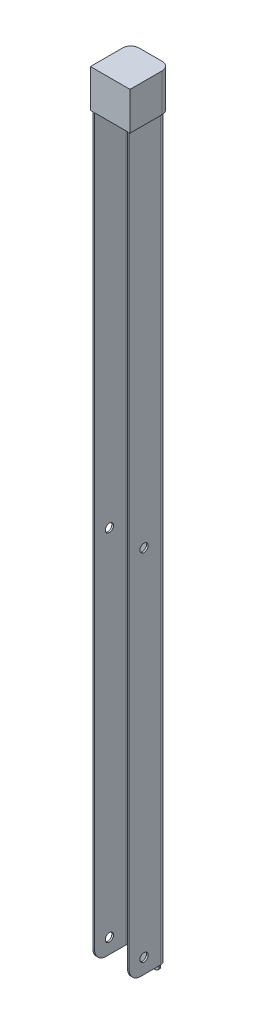
ISO-10303-21;
HEADER;
FILE_DESCRIPTION(('STEP AP214'),'2;1');
FILE_NAME('part.step','',(''),(''),'','','');
FILE_SCHEMA(('AUTOMOTIVE_DESIGN { 1 0 10303 214 1 1 1 1 }'));
ENDSEC;
DATA;
#1=APPLICATION_CONTEXT('core data for automotive mechanical design processes');
#2=APPLICATION_PROTOCOL_DEFINITION('international standard','automotive_design',2000,#1);
#3=PRODUCT_CONTEXT('',#1,'mechanical');
#4=PRODUCT('Part','Part','',(#3));
#5=PRODUCT_RELATED_PRODUCT_CATEGORY('part','',(#4));
#6=PRODUCT_DEFINITION_FORMATION('','',#4);
#7=PRODUCT_DEFINITION_CONTEXT('part definition',#1,'design');
#8=PRODUCT_DEFINITION('design','',#6,#7);
#9=PRODUCT_DEFINITION_SHAPE('','',#8);
#10=(LENGTH_UNIT() NAMED_UNIT(*) SI_UNIT(.MILLI.,.METRE.));
#11=(NAMED_UNIT(*) PLANE_ANGLE_UNIT() SI_UNIT($,.RADIAN.));
#12=(NAMED_UNIT(*) SI_UNIT($,.STERADIAN.) SOLID_ANGLE_UNIT());
#13=UNCERTAINTY_MEASURE_WITH_UNIT(LENGTH_MEASURE(1.E-05),#10,'distance_accuracy_value','');
#14=(GEOMETRIC_REPRESENTATION_CONTEXT(3) GLOBAL_UNCERTAINTY_ASSIGNED_CONTEXT((#13)) GLOBAL_UNIT_ASSIGNED_CONTEXT((#10,
#11,#12)) REPRESENTATION_CONTEXT('',''));
#15=CARTESIAN_POINT('',(0.,0.,0.));
#16=DIRECTION('',(0.,0.,1.));
#17=DIRECTION('',(1.,0.,0.));
#18=AXIS2_PLACEMENT_3D('',#15,#16,#17);
#19=CARTESIAN_POINT('',(7.,0.,-7.5));
#20=DIRECTION('',(0.,-1.,0.));
#21=DIRECTION('',(-1.,0.,0.));
#22=AXIS2_PLACEMENT_3D('',#19,#20,#21);
#23=PLANE('',#22);
#24=DIRECTION('',(0.,0.,-1.));
#25=VECTOR('',#24,1.);
#26=CARTESIAN_POINT('',(6.99999999999999,0.,-10.5));
#27=LINE('',#26,#25);
#28=CARTESIAN_POINT('',(6.99999999999999,0.,-10.5));
#29=VERTEX_POINT('',#28);
#30=CARTESIAN_POINT('',(6.99999999999999,0.,-11.5));
#31=VERTEX_POINT('',#30);
#32=EDGE_CURVE('E225',#29,#31,#27,.T.);
#33=ORIENTED_EDGE('',*,*,#32,.T.);
#34=CARTESIAN_POINT('',(7.,0.,-7.5));
#35=DIRECTION('',(0.,-1.,0.));
#36=DIRECTION('',(0.,0.,-1.));
#37=AXIS2_PLACEMENT_3D('',#34,#35,#36);
#38=CIRCLE('',#37,4.);
#39=CARTESIAN_POINT('',(11.,0.,-7.5));
#40=VERTEX_POINT('',#39);
#41=EDGE_CURVE('E199',#31,#40,#38,.T.);
#42=ORIENTED_EDGE('',*,*,#41,.T.);
#43=DIRECTION('',(0.,0.,1.));
#44=VECTOR('',#43,1.);
#45=CARTESIAN_POINT('',(11.,0.,-7.5));
#46=LINE('',#45,#44);
#47=CARTESIAN_POINT('',(11.,0.,4.5));
#48=VERTEX_POINT('',#47);
#49=EDGE_CURVE('E211',#40,#48,#46,.T.);
#50=ORIENTED_EDGE('',*,*,#49,.T.);
#51=DIRECTION('',(-1.,0.,0.));
#52=VECTOR('',#51,1.);
#53=CARTESIAN_POINT('',(7.,0.,4.5));
#54=LINE('',#53,#52);
#55=CARTESIAN_POINT('',(10.,0.,4.5));
#56=VERTEX_POINT('',#55);
#57=EDGE_CURVE('E369',#48,#56,#54,.T.);
#58=ORIENTED_EDGE('',*,*,#57,.T.);
#59=DIRECTION('',(0.,0.,1.));
#60=VECTOR('',#59,1.);
#61=CARTESIAN_POINT('',(9.99999999999999,0.,-7.5));
#62=LINE('',#61,#60);
#63=CARTESIAN_POINT('',(9.99999999999999,0.,-7.5));
#64=VERTEX_POINT('',#63);
#65=EDGE_CURVE('E328',#64,#56,#62,.T.);
#66=ORIENTED_EDGE('',*,*,#65,.F.);
#67=CARTESIAN_POINT('',(7.,0.,-7.5));
#68=DIRECTION('',(0.,1.,0.));
#69=DIRECTION('',(1.,0.,0.));
#70=AXIS2_PLACEMENT_3D('',#67,#68,#69);
#71=CIRCLE('',#70,3.);
#72=EDGE_CURVE('E228',#29,#64,#71,.F.);
#73=ORIENTED_EDGE('',*,*,#72,.F.);
#74=EDGE_LOOP('',(#33,#42,#50,#58,#66,#73));
#75=FACE_BOUND('',#74,.T.);
#76=ADVANCED_FACE('F36',(#75),#23,.T.);
#77=CARTESIAN_POINT('',(9.99999999999999,470.,-7.5));
#78=DIRECTION('',(1.,0.,0.));
#79=DIRECTION('',(0.,0.,-1.));
#80=AXIS2_PLACEMENT_3D('',#77,#78,#79);
#81=PLANE('',#80);
#82=CARTESIAN_POINT('',(10.,9.,2.5));
#83=DIRECTION('',(1.,0.,0.));
#84=DIRECTION('',(0.,0.,-1.));
#85=AXIS2_PLACEMENT_3D('',#82,#83,#84);
#86=CIRCLE('',#85,2.5);
#87=CARTESIAN_POINT('',(10.,9.,5.));
#88=VERTEX_POINT('',#87);
#89=EDGE_CURVE('E240',#88,#88,#86,.T.);
#90=ORIENTED_EDGE('',*,*,#89,.T.);
#91=EDGE_LOOP('',(#90));
#92=FACE_BOUND('',#91,.T.);
#93=CARTESIAN_POINT('',(10.,224.,2.5));
#94=DIRECTION('',(1.,0.,0.));
#95=DIRECTION('',(0.,0.,-1.));
#96=AXIS2_PLACEMENT_3D('',#93,#94,#95);
#97=CIRCLE('',#96,2.5);
#98=CARTESIAN_POINT('',(10.,224.,5.));
#99=VERTEX_POINT('',#98);
#100=EDGE_CURVE('E409',#99,#99,#97,.T.);
#101=ORIENTED_EDGE('',*,*,#100,.T.);
#102=EDGE_LOOP('',(#101));
#103=FACE_BOUND('',#102,.T.);
#104=DIRECTION('',(0.,0.,1.));
#105=VECTOR('',#104,1.);
#106=CARTESIAN_POINT('',(9.99999999999999,447.,-7.5));
#107=LINE('',#106,#105);
#108=CARTESIAN_POINT('',(9.99999999999999,447.,-7.5));
#109=VERTEX_POINT('',#108);
#110=CARTESIAN_POINT('',(10.,447.,11.5));
#111=VERTEX_POINT('',#110);
#112=EDGE_CURVE('E325',#109,#111,#107,.T.);
#113=ORIENTED_EDGE('',*,*,#112,.F.);
#114=DIRECTION('',(0.,-1.,0.));
#115=VECTOR('',#114,1.);
#116=CARTESIAN_POINT('',(9.99999999999999,470.,-7.5));
#117=LINE('',#116,#115);
#118=EDGE_CURVE('E344',#109,#64,#117,.T.);
#119=ORIENTED_EDGE('',*,*,#118,.T.);
#120=ORIENTED_EDGE('',*,*,#65,.T.);
#121=CARTESIAN_POINT('',(10.,7.,4.5));
#122=DIRECTION('',(1.,0.,0.));
#123=DIRECTION('',(0.,0.,-1.));
#124=AXIS2_PLACEMENT_3D('',#121,#122,#123);
#125=CIRCLE('',#124,7.);
#126=CARTESIAN_POINT('',(10.,7.00000000000012,11.5));
#127=VERTEX_POINT('',#126);
#128=EDGE_CURVE('E372',#56,#127,#125,.F.);
#129=ORIENTED_EDGE('',*,*,#128,.T.);
#130=DIRECTION('',(0.,-1.,0.));
#131=VECTOR('',#130,1.);
#132=CARTESIAN_POINT('',(10.,470.,11.5));
#133=LINE('',#132,#131);
#134=EDGE_CURVE('E364',#111,#127,#133,.T.);
#135=ORIENTED_EDGE('',*,*,#134,.F.);
#136=EDGE_LOOP('',(#113,#119,#120,#129,#135));
#137=FACE_BOUND('',#136,.T.);
#138=ADVANCED_FACE('F470',(#92,#103,#137),#81,.F.);
#139=CARTESIAN_POINT('',(11.,470.,11.5));
#140=DIRECTION('',(0.,0.,1.));
#141=DIRECTION('',(1.,0.,0.));
#142=AXIS2_PLACEMENT_3D('',#139,#140,#141);
#143=PLANE('',#142);
#144=DIRECTION('',(0.,-1.,0.));
#145=VECTOR('',#144,1.);
#146=CARTESIAN_POINT('',(11.,470.,11.5));
#147=LINE('',#146,#145);
#148=CARTESIAN_POINT('',(11.,447.,11.5));
#149=VERTEX_POINT('',#148);
#150=CARTESIAN_POINT('',(11.,7.00000000000012,11.5));
#151=VERTEX_POINT('',#150);
#152=EDGE_CURVE('E362',#149,#151,#147,.T.);
#153=ORIENTED_EDGE('',*,*,#152,.F.);
#154=DIRECTION('',(-1.,0.,0.));
#155=VECTOR('',#154,1.);
#156=CARTESIAN_POINT('',(11.,447.,11.5));
#157=LINE('',#156,#155);
#158=EDGE_CURVE('E323',#149,#111,#157,.T.);
#159=ORIENTED_EDGE('',*,*,#158,.T.);
#160=ORIENTED_EDGE('',*,*,#134,.T.);
#161=DIRECTION('',(-1.,0.,0.));
#162=VECTOR('',#161,1.);
#163=CARTESIAN_POINT('',(11.,7.00000000000001,11.5));
#164=LINE('',#163,#162);
#165=EDGE_CURVE('E375',#127,#151,#164,.F.);
#166=ORIENTED_EDGE('',*,*,#165,.T.);
#167=EDGE_LOOP('',(#153,#159,#160,#166));
#168=FACE_BOUND('',#167,.T.);
#169=ADVANCED_FACE('F492',(#168),#143,.T.);
#170=CARTESIAN_POINT('',(11.,470.,-7.5));
#171=DIRECTION('',(1.,0.,0.));
#172=DIRECTION('',(0.,0.,-1.));
#173=AXIS2_PLACEMENT_3D('',#170,#171,#172);
#174=PLANE('',#173);
#175=CARTESIAN_POINT('',(11.,9.,2.5));
#176=DIRECTION('',(1.,0.,0.));
#177=DIRECTION('',(0.,0.,-1.));
#178=AXIS2_PLACEMENT_3D('',#175,#176,#177);
#179=CIRCLE('',#178,2.5);
#180=CARTESIAN_POINT('',(11.,9.,5.));
#181=VERTEX_POINT('',#180);
#182=EDGE_CURVE('E246',#181,#181,#179,.T.);
#183=ORIENTED_EDGE('',*,*,#182,.F.);
#184=EDGE_LOOP('',(#183));
#185=FACE_BOUND('',#184,.T.);
#186=CARTESIAN_POINT('',(11.,224.,2.5));
#187=DIRECTION('',(1.,0.,0.));
#188=DIRECTION('',(0.,0.,-1.));
#189=AXIS2_PLACEMENT_3D('',#186,#187,#188);
#190=CIRCLE('',#189,2.5);
#191=CARTESIAN_POINT('',(11.,224.,5.));
#192=VERTEX_POINT('',#191);
#193=EDGE_CURVE('E404',#192,#192,#190,.T.);
#194=ORIENTED_EDGE('',*,*,#193,.F.);
#195=EDGE_LOOP('',(#194));
#196=FACE_BOUND('',#195,.T.);
#197=DIRECTION('',(0.,-1.,0.));
#198=VECTOR('',#197,1.);
#199=CARTESIAN_POINT('',(11.,470.,-7.5));
#200=LINE('',#199,#198);
#201=CARTESIAN_POINT('',(11.,447.,-7.5));
#202=VERTEX_POINT('',#201);
#203=EDGE_CURVE('E205',#202,#40,#200,.T.);
#204=ORIENTED_EDGE('',*,*,#203,.F.);
#205=DIRECTION('',(0.,0.,1.));
#206=VECTOR('',#205,1.);
#207=CARTESIAN_POINT('',(11.,447.,-7.5));
#208=LINE('',#207,#206);
#209=EDGE_CURVE('E321',#202,#149,#208,.T.);
#210=ORIENTED_EDGE('',*,*,#209,.T.);
#211=ORIENTED_EDGE('',*,*,#152,.T.);
#212=CARTESIAN_POINT('',(11.,7.,4.5));
#213=DIRECTION('',(1.,0.,0.));
#214=DIRECTION('',(0.,0.,-1.));
#215=AXIS2_PLACEMENT_3D('',#212,#213,#214);
#216=CIRCLE('',#215,7.);
#217=EDGE_CURVE('E378',#151,#48,#216,.T.);
#218=ORIENTED_EDGE('',*,*,#217,.T.);
#219=ORIENTED_EDGE('',*,*,#49,.F.);
#220=EDGE_LOOP('',(#204,#210,#211,#218,#219));
#221=FACE_BOUND('',#220,.T.);
#222=ADVANCED_FACE('F460',(#185,#196,#221),#174,.T.);
#223=CARTESIAN_POINT('',(7.,470.,-7.5));
#224=DIRECTION('',(0.,-1.,0.));
#225=DIRECTION('',(0.,0.,-1.));
#226=AXIS2_PLACEMENT_3D('',#223,#224,#225);
#227=CYLINDRICAL_SURFACE('',#226,4.);
#228=DIRECTION('',(0.,-1.,0.));
#229=VECTOR('',#228,1.);
#230=CARTESIAN_POINT('',(6.99999999999999,470.,-11.5));
#231=LINE('',#230,#229);
#232=CARTESIAN_POINT('',(6.99999999999999,447.,-11.5));
#233=VERTEX_POINT('',#232);
#234=EDGE_CURVE('E202',#233,#31,#231,.T.);
#235=ORIENTED_EDGE('',*,*,#234,.F.);
#236=CARTESIAN_POINT('',(7.,447.,-7.5));
#237=DIRECTION('',(0.,1.,0.));
#238=DIRECTION('',(0.,0.,1.));
#239=AXIS2_PLACEMENT_3D('',#236,#237,#238);
#240=CIRCLE('',#239,4.);
#241=EDGE_CURVE('E319',#233,#202,#240,.F.);
#242=ORIENTED_EDGE('',*,*,#241,.T.);
#243=ORIENTED_EDGE('',*,*,#203,.T.);
#244=ORIENTED_EDGE('',*,*,#41,.F.);
#245=EDGE_LOOP('',(#235,#242,#243,#244));
#246=FACE_BOUND('',#245,.T.);
#247=ADVANCED_FACE('F201',(#246),#227,.T.);
#248=CARTESIAN_POINT('',(6.99999999999999,470.,-11.5));
#249=DIRECTION('',(0.,0.,-1.));
#250=DIRECTION('',(-1.,0.,0.));
#251=AXIS2_PLACEMENT_3D('',#248,#249,#250);
#252=PLANE('',#251);
#253=DIRECTION('',(0.,-1.,0.));
#254=VECTOR('',#253,1.);
#255=CARTESIAN_POINT('',(6.99999999999999,0.,-11.5));
#256=LINE('',#255,#254);
#257=CARTESIAN_POINT('',(6.99999999999999,-5.,-11.5));
#258=VERTEX_POINT('',#257);
#259=EDGE_CURVE('E217',#31,#258,#256,.T.);
#260=ORIENTED_EDGE('',*,*,#259,.T.);
#261=CARTESIAN_POINT('',(4.99999999999999,-5.,-11.5));
#262=DIRECTION('',(0.,0.,-1.));
#263=DIRECTION('',(-1.,0.,0.));
#264=AXIS2_PLACEMENT_3D('',#261,#262,#263);
#265=CIRCLE('',#264,2.);
#266=CARTESIAN_POINT('',(4.99999999999999,-7.,-11.5));
#267=VERTEX_POINT('',#266);
#268=EDGE_CURVE('E394',#258,#267,#265,.T.);
#269=ORIENTED_EDGE('',*,*,#268,.T.);
#270=DIRECTION('',(-1.,0.,0.));
#271=VECTOR('',#270,1.);
#272=CARTESIAN_POINT('',(6.99999999999999,-7.,-11.5));
#273=LINE('',#272,#271);
#274=CARTESIAN_POINT('',(-5.,-7.,-11.5));
#275=VERTEX_POINT('',#274);
#276=EDGE_CURVE('E239',#267,#275,#273,.T.);
#277=ORIENTED_EDGE('',*,*,#276,.T.);
#278=CARTESIAN_POINT('',(-5.,-5.,-11.5));
#279=DIRECTION('',(0.,0.,-1.));
#280=DIRECTION('',(-1.,0.,0.));
#281=AXIS2_PLACEMENT_3D('',#278,#279,#280);
#282=CIRCLE('',#281,2.);
#283=CARTESIAN_POINT('',(-7.,-5.,-11.5));
#284=VERTEX_POINT('',#283);
#285=EDGE_CURVE('E392',#275,#284,#282,.T.);
#286=ORIENTED_EDGE('',*,*,#285,.T.);
#287=DIRECTION('',(0.,1.,0.));
#288=VECTOR('',#287,1.);
#289=CARTESIAN_POINT('',(-7.,0.,-11.5));
#290=LINE('',#289,#288);
#291=CARTESIAN_POINT('',(-7.,0.,-11.5));
#292=VERTEX_POINT('',#291);
#293=EDGE_CURVE('E243',#284,#292,#290,.T.);
#294=ORIENTED_EDGE('',*,*,#293,.T.);
#295=DIRECTION('',(0.,-1.,0.));
#296=VECTOR('',#295,1.);
#297=CARTESIAN_POINT('',(-7.,470.,-11.5));
#298=LINE('',#297,#296);
#299=CARTESIAN_POINT('',(-7.,447.,-11.5));
#300=VERTEX_POINT('',#299);
#301=EDGE_CURVE('E221',#300,#292,#298,.T.);
#302=ORIENTED_EDGE('',*,*,#301,.F.);
#303=DIRECTION('',(1.,0.,0.));
#304=VECTOR('',#303,1.);
#305=CARTESIAN_POINT('',(6.99999999999999,447.,-11.5));
#306=LINE('',#305,#304);
#307=EDGE_CURVE('E220',#300,#233,#306,.T.);
#308=ORIENTED_EDGE('',*,*,#307,.T.);
#309=ORIENTED_EDGE('',*,*,#234,.T.);
#310=EDGE_LOOP('',(#260,#269,#277,#286,#294,#302,#308,#309));
#311=FACE_BOUND('',#310,.T.);
#312=ADVANCED_FACE('F215',(#311),#252,.T.);
#313=CARTESIAN_POINT('',(-7.,470.,-7.5));
#314=DIRECTION('',(0.,-1.,0.));
#315=DIRECTION('',(0.,0.,-1.));
#316=AXIS2_PLACEMENT_3D('',#313,#314,#315);
#317=CYLINDRICAL_SURFACE('',#316,4.);
#318=DIRECTION('',(0.,-1.,0.));
#319=VECTOR('',#318,1.);
#320=CARTESIAN_POINT('',(-11.,470.,-7.5));
#321=LINE('',#320,#319);
#322=CARTESIAN_POINT('',(-11.,447.,-7.5));
#323=VERTEX_POINT('',#322);
#324=CARTESIAN_POINT('',(-11.,0.,-7.5));
#325=VERTEX_POINT('',#324);
#326=EDGE_CURVE('E357',#323,#325,#321,.T.);
#327=ORIENTED_EDGE('',*,*,#326,.F.);
#328=CARTESIAN_POINT('',(-7.,447.,-7.5));
#329=DIRECTION('',(0.,1.,0.));
#330=DIRECTION('',(0.,0.,1.));
#331=AXIS2_PLACEMENT_3D('',#328,#329,#330);
#332=CIRCLE('',#331,4.);
#333=EDGE_CURVE('E316',#323,#300,#332,.F.);
#334=ORIENTED_EDGE('',*,*,#333,.T.);
#335=ORIENTED_EDGE('',*,*,#301,.T.);
#336=CARTESIAN_POINT('',(-7.,0.,-7.5));
#337=DIRECTION('',(0.,-1.,0.));
#338=DIRECTION('',(0.,0.,1.));
#339=AXIS2_PLACEMENT_3D('',#336,#337,#338);
#340=CIRCLE('',#339,4.);
#341=EDGE_CURVE('E210',#325,#292,#340,.T.);
#342=ORIENTED_EDGE('',*,*,#341,.F.);
#343=EDGE_LOOP('',(#327,#334,#335,#342));
#344=FACE_BOUND('',#343,.T.);
#345=ADVANCED_FACE('F453',(#344),#317,.T.);
#346=CARTESIAN_POINT('',(-11.,470.,-7.5));
#347=DIRECTION('',(-1.,0.,0.));
#348=DIRECTION('',(0.,0.,1.));
#349=AXIS2_PLACEMENT_3D('',#346,#347,#348);
#350=PLANE('',#349);
#351=CARTESIAN_POINT('',(-11.,9.,2.5));
#352=DIRECTION('',(-1.,0.,0.));
#353=DIRECTION('',(0.,0.,1.));
#354=AXIS2_PLACEMENT_3D('',#351,#352,#353);
#355=CIRCLE('',#354,2.5);
#356=CARTESIAN_POINT('',(-11.,9.,5.));
#357=VERTEX_POINT('',#356);
#358=EDGE_CURVE('E405',#357,#357,#355,.T.);
#359=ORIENTED_EDGE('',*,*,#358,.F.);
#360=EDGE_LOOP('',(#359));
#361=FACE_BOUND('',#360,.T.);
#362=CARTESIAN_POINT('',(-11.,224.,2.5));
#363=DIRECTION('',(-1.,0.,0.));
#364=DIRECTION('',(0.,0.,1.));
#365=AXIS2_PLACEMENT_3D('',#362,#363,#364);
#366=CIRCLE('',#365,2.5);
#367=CARTESIAN_POINT('',(-11.,224.,5.));
#368=VERTEX_POINT('',#367);
#369=EDGE_CURVE('E412',#368,#368,#366,.T.);
#370=ORIENTED_EDGE('',*,*,#369,.F.);
#371=EDGE_LOOP('',(#370));
#372=FACE_BOUND('',#371,.T.);
#373=DIRECTION('',(0.,-1.,0.));
#374=VECTOR('',#373,1.);
#375=CARTESIAN_POINT('',(-11.,470.,11.5));
#376=LINE('',#375,#374);
#377=CARTESIAN_POINT('',(-11.,447.,11.5));
#378=VERTEX_POINT('',#377);
#379=CARTESIAN_POINT('',(-11.,7.00000000000012,11.5));
#380=VERTEX_POINT('',#379);
#381=EDGE_CURVE('E355',#378,#380,#376,.T.);
#382=ORIENTED_EDGE('',*,*,#381,.F.);
#383=DIRECTION('',(0.,0.,-1.));
#384=VECTOR('',#383,1.);
#385=CARTESIAN_POINT('',(-11.,447.,-7.5));
#386=LINE('',#385,#384);
#387=EDGE_CURVE('E314',#378,#323,#386,.T.);
#388=ORIENTED_EDGE('',*,*,#387,.T.);
#389=ORIENTED_EDGE('',*,*,#326,.T.);
#390=DIRECTION('',(0.,0.,-1.));
#391=VECTOR('',#390,1.);
#392=CARTESIAN_POINT('',(-11.,0.,-7.5));
#393=LINE('',#392,#391);
#394=CARTESIAN_POINT('',(-11.,0.,4.5));
#395=VERTEX_POINT('',#394);
#396=EDGE_CURVE('E334',#395,#325,#393,.T.);
#397=ORIENTED_EDGE('',*,*,#396,.F.);
#398=CARTESIAN_POINT('',(-11.,7.,4.5));
#399=DIRECTION('',(-1.,0.,0.));
#400=DIRECTION('',(0.,0.,1.));
#401=AXIS2_PLACEMENT_3D('',#398,#399,#400);
#402=CIRCLE('',#401,7.);
#403=EDGE_CURVE('E380',#395,#380,#402,.T.);
#404=ORIENTED_EDGE('',*,*,#403,.T.);
#405=EDGE_LOOP('',(#382,#388,#389,#397,#404));
#406=FACE_BOUND('',#405,.T.);
#407=ADVANCED_FACE('F449',(#361,#372,#406),#350,.T.);
#408=CARTESIAN_POINT('',(-10.,470.,11.5));
#409=DIRECTION('',(0.,0.,1.));
#410=DIRECTION('',(1.,0.,0.));
#411=AXIS2_PLACEMENT_3D('',#408,#409,#410);
#412=PLANE('',#411);
#413=DIRECTION('',(0.,-1.,0.));
#414=VECTOR('',#413,1.);
#415=CARTESIAN_POINT('',(-10.,470.,11.5));
#416=LINE('',#415,#414);
#417=CARTESIAN_POINT('',(-10.,447.,11.5));
#418=VERTEX_POINT('',#417);
#419=CARTESIAN_POINT('',(-10.,7.00000000000012,11.5));
#420=VERTEX_POINT('',#419);
#421=EDGE_CURVE('E353',#418,#420,#416,.T.);
#422=ORIENTED_EDGE('',*,*,#421,.F.);
#423=DIRECTION('',(-1.,0.,0.));
#424=VECTOR('',#423,1.);
#425=CARTESIAN_POINT('',(-10.,447.,11.5));
#426=LINE('',#425,#424);
#427=EDGE_CURVE('E312',#418,#378,#426,.T.);
#428=ORIENTED_EDGE('',*,*,#427,.T.);
#429=ORIENTED_EDGE('',*,*,#381,.T.);
#430=DIRECTION('',(-1.,0.,0.));
#431=VECTOR('',#430,1.);
#432=CARTESIAN_POINT('',(-10.,7.00000000000001,11.5));
#433=LINE('',#432,#431);
#434=EDGE_CURVE('E383',#380,#420,#433,.F.);
#435=ORIENTED_EDGE('',*,*,#434,.T.);
#436=EDGE_LOOP('',(#422,#428,#429,#435));
#437=FACE_BOUND('',#436,.T.);
#438=ADVANCED_FACE('F476',(#437),#412,.T.);
#439=CARTESIAN_POINT('',(-10.,470.,-7.5));
#440=DIRECTION('',(-1.,0.,0.));
#441=DIRECTION('',(0.,0.,1.));
#442=AXIS2_PLACEMENT_3D('',#439,#440,#441);
#443=PLANE('',#442);
#444=CARTESIAN_POINT('',(-10.,9.,2.5));
#445=DIRECTION('',(-1.,0.,0.));
#446=DIRECTION('',(0.,0.,1.));
#447=AXIS2_PLACEMENT_3D('',#444,#445,#446);
#448=CIRCLE('',#447,2.5);
#449=CARTESIAN_POINT('',(-10.,9.,5.));
#450=VERTEX_POINT('',#449);
#451=EDGE_CURVE('E40',#450,#450,#448,.T.);
#452=ORIENTED_EDGE('',*,*,#451,.T.);
#453=EDGE_LOOP('',(#452));
#454=FACE_BOUND('',#453,.T.);
#455=CARTESIAN_POINT('',(-10.,224.,2.5));
#456=DIRECTION('',(-1.,0.,0.));
#457=DIRECTION('',(0.,0.,1.));
#458=AXIS2_PLACEMENT_3D('',#455,#456,#457);
#459=CIRCLE('',#458,2.5);
#460=CARTESIAN_POINT('',(-10.,224.,5.));
#461=VERTEX_POINT('',#460);
#462=EDGE_CURVE('E402',#461,#461,#459,.T.);
#463=ORIENTED_EDGE('',*,*,#462,.T.);
#464=EDGE_LOOP('',(#463));
#465=FACE_BOUND('',#464,.T.);
#466=DIRECTION('',(0.,0.,-1.));
#467=VECTOR('',#466,1.);
#468=CARTESIAN_POINT('',(-10.,447.,-7.5));
#469=LINE('',#468,#467);
#470=CARTESIAN_POINT('',(-10.,447.,-7.5));
#471=VERTEX_POINT('',#470);
#472=EDGE_CURVE('E309',#418,#471,#469,.T.);
#473=ORIENTED_EDGE('',*,*,#472,.F.);
#474=ORIENTED_EDGE('',*,*,#421,.T.);
#475=CARTESIAN_POINT('',(-10.,7.,4.5));
#476=DIRECTION('',(-1.,0.,0.));
#477=DIRECTION('',(0.,0.,1.));
#478=AXIS2_PLACEMENT_3D('',#475,#476,#477);
#479=CIRCLE('',#478,7.);
#480=CARTESIAN_POINT('',(-10.,0.,4.5));
#481=VERTEX_POINT('',#480);
#482=EDGE_CURVE('E386',#420,#481,#479,.F.);
#483=ORIENTED_EDGE('',*,*,#482,.T.);
#484=DIRECTION('',(0.,0.,-1.));
#485=VECTOR('',#484,1.);
#486=CARTESIAN_POINT('',(-10.,0.,-7.5));
#487=LINE('',#486,#485);
#488=CARTESIAN_POINT('',(-10.,0.,-7.5));
#489=VERTEX_POINT('',#488);
#490=EDGE_CURVE('E337',#481,#489,#487,.T.);
#491=ORIENTED_EDGE('',*,*,#490,.T.);
#492=DIRECTION('',(0.,-1.,0.));
#493=VECTOR('',#492,1.);
#494=CARTESIAN_POINT('',(-10.,470.,-7.5));
#495=LINE('',#494,#493);
#496=EDGE_CURVE('E351',#471,#489,#495,.T.);
#497=ORIENTED_EDGE('',*,*,#496,.F.);
#498=EDGE_LOOP('',(#473,#474,#483,#491,#497));
#499=FACE_BOUND('',#498,.T.);
#500=ADVANCED_FACE('F440',(#454,#465,#499),#443,.F.);
#501=CARTESIAN_POINT('',(-7.,470.,-7.5));
#502=DIRECTION('',(0.,-1.,0.));
#503=DIRECTION('',(0.,0.,-1.));
#504=AXIS2_PLACEMENT_3D('',#501,#502,#503);
#505=CYLINDRICAL_SURFACE('',#504,3.);
#506=CARTESIAN_POINT('',(-7.,447.,-7.5));
#507=DIRECTION('',(0.,1.,0.));
#508=DIRECTION('',(0.,0.,1.));
#509=AXIS2_PLACEMENT_3D('',#506,#507,#508);
#510=CIRCLE('',#509,3.);
#511=CARTESIAN_POINT('',(-7.,447.,-10.5));
#512=VERTEX_POINT('',#511);
#513=EDGE_CURVE('E306',#471,#512,#510,.F.);
#514=ORIENTED_EDGE('',*,*,#513,.F.);
#515=ORIENTED_EDGE('',*,*,#496,.T.);
#516=CARTESIAN_POINT('',(-7.,0.,-7.5));
#517=DIRECTION('',(0.,1.,0.));
#518=DIRECTION('',(1.,0.,0.));
#519=AXIS2_PLACEMENT_3D('',#516,#517,#518);
#520=CIRCLE('',#519,3.);
#521=CARTESIAN_POINT('',(-7.,0.,-10.5));
#522=VERTEX_POINT('',#521);
#523=EDGE_CURVE('E340',#489,#522,#520,.F.);
#524=ORIENTED_EDGE('',*,*,#523,.T.);
#525=DIRECTION('',(0.,-1.,0.));
#526=VECTOR('',#525,1.);
#527=CARTESIAN_POINT('',(-7.,470.,-10.5));
#528=LINE('',#527,#526);
#529=EDGE_CURVE('E348',#512,#522,#528,.T.);
#530=ORIENTED_EDGE('',*,*,#529,.F.);
#531=EDGE_LOOP('',(#514,#515,#524,#530));
#532=FACE_BOUND('',#531,.T.);
#533=ADVANCED_FACE('F437',(#532),#505,.F.);
#534=CARTESIAN_POINT('',(6.99999999999999,470.,-10.5));
#535=DIRECTION('',(0.,0.,-1.));
#536=DIRECTION('',(-1.,0.,0.));
#537=AXIS2_PLACEMENT_3D('',#534,#535,#536);
#538=PLANE('',#537);
#539=DIRECTION('',(-1.,0.,0.));
#540=VECTOR('',#539,1.);
#541=CARTESIAN_POINT('',(6.99999999999999,-7.,-10.5));
#542=LINE('',#541,#540);
#543=CARTESIAN_POINT('',(4.99999999999999,-7.,-10.5));
#544=VERTEX_POINT('',#543);
#545=CARTESIAN_POINT('',(-5.,-7.,-10.5));
#546=VERTEX_POINT('',#545);
#547=EDGE_CURVE('E423',#544,#546,#542,.T.);
#548=ORIENTED_EDGE('',*,*,#547,.F.);
#549=CARTESIAN_POINT('',(4.99999999999999,-5.,-10.5));
#550=DIRECTION('',(0.,0.,-1.));
#551=DIRECTION('',(-1.,0.,0.));
#552=AXIS2_PLACEMENT_3D('',#549,#550,#551);
#553=CIRCLE('',#552,2.);
#554=CARTESIAN_POINT('',(6.99999999999999,-5.,-10.5));
#555=VERTEX_POINT('',#554);
#556=EDGE_CURVE('E45',#544,#555,#553,.F.);
#557=ORIENTED_EDGE('',*,*,#556,.T.);
#558=DIRECTION('',(0.,-1.,0.));
#559=VECTOR('',#558,1.);
#560=CARTESIAN_POINT('',(6.99999999999999,0.,-10.5));
#561=LINE('',#560,#559);
#562=EDGE_CURVE('E252',#29,#555,#561,.T.);
#563=ORIENTED_EDGE('',*,*,#562,.F.);
#564=DIRECTION('',(0.,-1.,0.));
#565=VECTOR('',#564,1.);
#566=CARTESIAN_POINT('',(6.99999999999999,470.,-10.5));
#567=LINE('',#566,#565);
#568=CARTESIAN_POINT('',(6.99999999999999,447.,-10.5));
#569=VERTEX_POINT('',#568);
#570=EDGE_CURVE('E346',#569,#29,#567,.T.);
#571=ORIENTED_EDGE('',*,*,#570,.F.);
#572=DIRECTION('',(1.,0.,0.));
#573=VECTOR('',#572,1.);
#574=CARTESIAN_POINT('',(6.99999999999999,447.,-10.5));
#575=LINE('',#574,#573);
#576=EDGE_CURVE('E292',#512,#569,#575,.T.);
#577=ORIENTED_EDGE('',*,*,#576,.F.);
#578=ORIENTED_EDGE('',*,*,#529,.T.);
#579=DIRECTION('',(0.,1.,0.));
#580=VECTOR('',#579,1.);
#581=CARTESIAN_POINT('',(-7.,0.,-10.5));
#582=LINE('',#581,#580);
#583=CARTESIAN_POINT('',(-7.,-5.,-10.5));
#584=VERTEX_POINT('',#583);
#585=EDGE_CURVE('E249',#584,#522,#582,.T.);
#586=ORIENTED_EDGE('',*,*,#585,.F.);
#587=CARTESIAN_POINT('',(-5.,-5.,-10.5));
#588=DIRECTION('',(0.,0.,-1.));
#589=DIRECTION('',(-1.,0.,0.));
#590=AXIS2_PLACEMENT_3D('',#587,#588,#589);
#591=CIRCLE('',#590,2.);
#592=EDGE_CURVE('E58',#584,#546,#591,.F.);
#593=ORIENTED_EDGE('',*,*,#592,.T.);
#594=EDGE_LOOP('',(#548,#557,#563,#571,#577,#578,#586,#593));
#595=FACE_BOUND('',#594,.T.);
#596=ADVANCED_FACE('F434',(#595),#538,.F.);
#597=CARTESIAN_POINT('',(7.,470.,-7.5));
#598=DIRECTION('',(0.,-1.,0.));
#599=DIRECTION('',(0.,0.,-1.));
#600=AXIS2_PLACEMENT_3D('',#597,#598,#599);
#601=CYLINDRICAL_SURFACE('',#600,3.);
#602=CARTESIAN_POINT('',(7.,447.,-7.5));
#603=DIRECTION('',(0.,1.,0.));
#604=DIRECTION('',(0.,0.,1.));
#605=AXIS2_PLACEMENT_3D('',#602,#603,#604);
#606=CIRCLE('',#605,3.);
#607=EDGE_CURVE('E388',#569,#109,#606,.F.);
#608=ORIENTED_EDGE('',*,*,#607,.F.);
#609=ORIENTED_EDGE('',*,*,#570,.T.);
#610=ORIENTED_EDGE('',*,*,#72,.T.);
#611=ORIENTED_EDGE('',*,*,#118,.F.);
#612=EDGE_LOOP('',(#608,#609,#610,#611));
#613=FACE_BOUND('',#612,.T.);
#614=ADVANCED_FACE('F472',(#613),#601,.F.);
#615=DIRECTION('',(0.,0.,-1.));
#616=VECTOR('',#615,1.);
#617=CARTESIAN_POINT('',(-7.,0.,-10.5));
#618=LINE('',#617,#616);
#619=EDGE_CURVE('E233',#522,#292,#618,.T.);
#620=ORIENTED_EDGE('',*,*,#619,.F.);
#621=ORIENTED_EDGE('',*,*,#523,.F.);
#622=ORIENTED_EDGE('',*,*,#490,.F.);
#623=DIRECTION('',(-1.,0.,0.));
#624=VECTOR('',#623,1.);
#625=CARTESIAN_POINT('',(7.,0.,4.5));
#626=LINE('',#625,#624);
#627=EDGE_CURVE('E366',#481,#395,#626,.T.);
#628=ORIENTED_EDGE('',*,*,#627,.T.);
#629=ORIENTED_EDGE('',*,*,#396,.T.);
#630=ORIENTED_EDGE('',*,*,#341,.T.);
#631=EDGE_LOOP('',(#620,#621,#622,#628,#629,#630));
#632=FACE_BOUND('',#631,.T.);
#633=ADVANCED_FACE('F430',(#632),#23,.T.);
#634=CARTESIAN_POINT('',(7.,7.,4.5));
#635=DIRECTION('',(-1.,0.,0.));
#636=DIRECTION('',(0.,0.,1.));
#637=AXIS2_PLACEMENT_3D('',#634,#635,#636);
#638=CYLINDRICAL_SURFACE('',#637,7.);
#639=ORIENTED_EDGE('',*,*,#217,.F.);
#640=ORIENTED_EDGE('',*,*,#165,.F.);
#641=ORIENTED_EDGE('',*,*,#128,.F.);
#642=ORIENTED_EDGE('',*,*,#57,.F.);
#643=EDGE_LOOP('',(#639,#640,#641,#642));
#644=FACE_BOUND('',#643,.T.);
#645=ADVANCED_FACE('F465',(#644),#638,.T.);
#646=CARTESIAN_POINT('',(7.,7.,4.5));
#647=DIRECTION('',(-1.,0.,0.));
#648=DIRECTION('',(0.,0.,1.));
#649=AXIS2_PLACEMENT_3D('',#646,#647,#648);
#650=CYLINDRICAL_SURFACE('',#649,7.);
#651=ORIENTED_EDGE('',*,*,#482,.F.);
#652=ORIENTED_EDGE('',*,*,#434,.F.);
#653=ORIENTED_EDGE('',*,*,#403,.F.);
#654=ORIENTED_EDGE('',*,*,#627,.F.);
#655=EDGE_LOOP('',(#651,#652,#653,#654));
#656=FACE_BOUND('',#655,.T.);
#657=ADVANCED_FACE('F445',(#656),#650,.T.);
#658=CARTESIAN_POINT('',(7.,447.,-7.5));
#659=DIRECTION('',(0.,1.,0.));
#660=DIRECTION('',(0.,0.,1.));
#661=AXIS2_PLACEMENT_3D('',#658,#659,#660);
#662=PLANE('',#661);
#663=DIRECTION('',(0.,0.,1.));
#664=VECTOR('',#663,1.);
#665=CARTESIAN_POINT('',(-12.,447.,11.5));
#666=LINE('',#665,#664);
#667=CARTESIAN_POINT('',(-12.,447.,-7.5));
#668=VERTEX_POINT('',#667);
#669=CARTESIAN_POINT('',(-12.,447.,12.));
#670=VERTEX_POINT('',#669);
#671=EDGE_CURVE('E256',#668,#670,#666,.T.);
#672=ORIENTED_EDGE('',*,*,#671,.F.);
#673=CARTESIAN_POINT('',(-7.,447.,-7.5));
#674=DIRECTION('',(0.,1.,0.));
#675=DIRECTION('',(0.,0.,1.));
#676=AXIS2_PLACEMENT_3D('',#673,#674,#675);
#677=CIRCLE('',#676,5.);
#678=CARTESIAN_POINT('',(-7.,447.,-12.5));
#679=VERTEX_POINT('',#678);
#680=EDGE_CURVE('E271',#679,#668,#677,.T.);
#681=ORIENTED_EDGE('',*,*,#680,.F.);
#682=DIRECTION('',(-1.,0.,0.));
#683=VECTOR('',#682,1.);
#684=CARTESIAN_POINT('',(-7.,447.,-12.5));
#685=LINE('',#684,#683);
#686=CARTESIAN_POINT('',(6.99999999999999,447.,-12.5));
#687=VERTEX_POINT('',#686);
#688=EDGE_CURVE('E268',#687,#679,#685,.T.);
#689=ORIENTED_EDGE('',*,*,#688,.F.);
#690=CARTESIAN_POINT('',(7.,447.,-7.5));
#691=DIRECTION('',(0.,1.,0.));
#692=DIRECTION('',(0.,0.,1.));
#693=AXIS2_PLACEMENT_3D('',#690,#691,#692);
#694=CIRCLE('',#693,5.);
#695=CARTESIAN_POINT('',(12.,447.,-7.5));
#696=VERTEX_POINT('',#695);
#697=EDGE_CURVE('E265',#696,#687,#694,.T.);
#698=ORIENTED_EDGE('',*,*,#697,.F.);
#699=DIRECTION('',(0.,0.,-1.));
#700=VECTOR('',#699,1.);
#701=CARTESIAN_POINT('',(12.,447.,12.));
#702=LINE('',#701,#700);
#703=CARTESIAN_POINT('',(12.,447.,12.));
#704=VERTEX_POINT('',#703);
#705=EDGE_CURVE('E263',#704,#696,#702,.T.);
#706=ORIENTED_EDGE('',*,*,#705,.F.);
#707=DIRECTION('',(1.,0.,0.));
#708=VECTOR('',#707,1.);
#709=CARTESIAN_POINT('',(-12.,447.,12.));
#710=LINE('',#709,#708);
#711=EDGE_CURVE('E259',#670,#704,#710,.T.);
#712=ORIENTED_EDGE('',*,*,#711,.F.);
#713=EDGE_LOOP('',(#672,#681,#689,#698,#706,#712));
#714=FACE_BOUND('',#713,.T.);
#715=ORIENTED_EDGE('',*,*,#607,.T.);
#716=ORIENTED_EDGE('',*,*,#112,.T.);
#717=ORIENTED_EDGE('',*,*,#158,.F.);
#718=ORIENTED_EDGE('',*,*,#209,.F.);
#719=ORIENTED_EDGE('',*,*,#241,.F.);
#720=ORIENTED_EDGE('',*,*,#307,.F.);
#721=ORIENTED_EDGE('',*,*,#333,.F.);
#722=ORIENTED_EDGE('',*,*,#387,.F.);
#723=ORIENTED_EDGE('',*,*,#427,.F.);
#724=ORIENTED_EDGE('',*,*,#472,.T.);
#725=ORIENTED_EDGE('',*,*,#513,.T.);
#726=ORIENTED_EDGE('',*,*,#576,.T.);
#727=EDGE_LOOP('',(#715,#716,#717,#718,#719,#720,#721,#722,#723,#724,#725,#726));
#728=FACE_BOUND('',#727,.T.);
#729=ADVANCED_FACE('F456',(#714,#728),#662,.F.);
#730=CARTESIAN_POINT('',(-12.,447.,11.5));
#731=DIRECTION('',(-1.,0.,0.));
#732=DIRECTION('',(0.,0.,1.));
#733=AXIS2_PLACEMENT_3D('',#730,#731,#732);
#734=PLANE('',#733);
#735=DIRECTION('',(0.,0.,1.));
#736=VECTOR('',#735,1.);
#737=CARTESIAN_POINT('',(-12.,470.,11.5));
#738=LINE('',#737,#736);
#739=CARTESIAN_POINT('',(-12.,470.,-7.5));
#740=VERTEX_POINT('',#739);
#741=CARTESIAN_POINT('',(-12.,470.,12.));
#742=VERTEX_POINT('',#741);
#743=EDGE_CURVE('E260',#740,#742,#738,.T.);
#744=ORIENTED_EDGE('',*,*,#743,.F.);
#745=DIRECTION('',(0.,1.,0.));
#746=VECTOR('',#745,1.);
#747=CARTESIAN_POINT('',(-12.,447.,-7.5));
#748=LINE('',#747,#746);
#749=EDGE_CURVE('E290',#668,#740,#748,.T.);
#750=ORIENTED_EDGE('',*,*,#749,.F.);
#751=ORIENTED_EDGE('',*,*,#671,.T.);
#752=DIRECTION('',(0.,1.,0.));
#753=VECTOR('',#752,1.);
#754=CARTESIAN_POINT('',(-12.,447.,12.));
#755=LINE('',#754,#753);
#756=EDGE_CURVE('E274',#670,#742,#755,.T.);
#757=ORIENTED_EDGE('',*,*,#756,.T.);
#758=EDGE_LOOP('',(#744,#750,#751,#757));
#759=FACE_BOUND('',#758,.T.);
#760=ADVANCED_FACE('F645',(#759),#734,.T.);
#761=CARTESIAN_POINT('',(-7.,447.,-7.5));
#762=DIRECTION('',(0.,1.,0.));
#763=DIRECTION('',(0.,0.,1.));
#764=AXIS2_PLACEMENT_3D('',#761,#762,#763);
#765=CYLINDRICAL_SURFACE('',#764,5.);
#766=CARTESIAN_POINT('',(-7.,470.,-7.5));
#767=DIRECTION('',(0.,1.,0.));
#768=DIRECTION('',(0.,0.,1.));
#769=AXIS2_PLACEMENT_3D('',#766,#767,#768);
#770=CIRCLE('',#769,5.);
#771=CARTESIAN_POINT('',(-7.,470.,-12.5));
#772=VERTEX_POINT('',#771);
#773=EDGE_CURVE('E286',#772,#740,#770,.T.);
#774=ORIENTED_EDGE('',*,*,#773,.F.);
#775=DIRECTION('',(0.,1.,0.));
#776=VECTOR('',#775,1.);
#777=CARTESIAN_POINT('',(-7.,447.,-12.5));
#778=LINE('',#777,#776);
#779=EDGE_CURVE('E293',#679,#772,#778,.T.);
#780=ORIENTED_EDGE('',*,*,#779,.F.);
#781=ORIENTED_EDGE('',*,*,#680,.T.);
#782=ORIENTED_EDGE('',*,*,#749,.T.);
#783=EDGE_LOOP('',(#774,#780,#781,#782));
#784=FACE_BOUND('',#783,.T.);
#785=ADVANCED_FACE('F649',(#784),#765,.T.);
#786=CARTESIAN_POINT('',(-7.,447.,-12.5));
#787=DIRECTION('',(0.,0.,-1.));
#788=DIRECTION('',(-1.,0.,0.));
#789=AXIS2_PLACEMENT_3D('',#786,#787,#788);
#790=PLANE('',#789);
#791=DIRECTION('',(-1.,0.,0.));
#792=VECTOR('',#791,1.);
#793=CARTESIAN_POINT('',(-7.,470.,-12.5));
#794=LINE('',#793,#792);
#795=CARTESIAN_POINT('',(6.99999999999999,470.,-12.5));
#796=VERTEX_POINT('',#795);
#797=EDGE_CURVE('E283',#796,#772,#794,.T.);
#798=ORIENTED_EDGE('',*,*,#797,.F.);
#799=DIRECTION('',(0.,1.,0.));
#800=VECTOR('',#799,1.);
#801=CARTESIAN_POINT('',(6.99999999999999,447.,-12.5));
#802=LINE('',#801,#800);
#803=EDGE_CURVE('E295',#687,#796,#802,.T.);
#804=ORIENTED_EDGE('',*,*,#803,.F.);
#805=ORIENTED_EDGE('',*,*,#688,.T.);
#806=ORIENTED_EDGE('',*,*,#779,.T.);
#807=EDGE_LOOP('',(#798,#804,#805,#806));
#808=FACE_BOUND('',#807,.T.);
#809=ADVANCED_FACE('F653',(#808),#790,.T.);
#810=CARTESIAN_POINT('',(7.,447.,-7.5));
#811=DIRECTION('',(0.,1.,0.));
#812=DIRECTION('',(0.,0.,1.));
#813=AXIS2_PLACEMENT_3D('',#810,#811,#812);
#814=CYLINDRICAL_SURFACE('',#813,5.);
#815=CARTESIAN_POINT('',(7.,470.,-7.5));
#816=DIRECTION('',(0.,1.,0.));
#817=DIRECTION('',(0.,0.,1.));
#818=AXIS2_PLACEMENT_3D('',#815,#816,#817);
#819=CIRCLE('',#818,5.);
#820=CARTESIAN_POINT('',(12.,470.,-7.5));
#821=VERTEX_POINT('',#820);
#822=EDGE_CURVE('E280',#821,#796,#819,.T.);
#823=ORIENTED_EDGE('',*,*,#822,.F.);
#824=DIRECTION('',(0.,1.,0.));
#825=VECTOR('',#824,1.);
#826=CARTESIAN_POINT('',(12.,447.,-7.5));
#827=LINE('',#826,#825);
#828=EDGE_CURVE('E297',#696,#821,#827,.T.);
#829=ORIENTED_EDGE('',*,*,#828,.F.);
#830=ORIENTED_EDGE('',*,*,#697,.T.);
#831=ORIENTED_EDGE('',*,*,#803,.T.);
#832=EDGE_LOOP('',(#823,#829,#830,#831));
#833=FACE_BOUND('',#832,.T.);
#834=ADVANCED_FACE('F657',(#833),#814,.T.);
#835=CARTESIAN_POINT('',(12.,447.,-7.5));
#836=DIRECTION('',(1.,0.,0.));
#837=DIRECTION('',(0.,0.,-1.));
#838=AXIS2_PLACEMENT_3D('',#835,#836,#837);
#839=PLANE('',#838);
#840=DIRECTION('',(0.,0.,-1.));
#841=VECTOR('',#840,1.);
#842=CARTESIAN_POINT('',(12.,470.,-7.5));
#843=LINE('',#842,#841);
#844=CARTESIAN_POINT('',(12.,470.,12.));
#845=VERTEX_POINT('',#844);
#846=EDGE_CURVE('E277',#845,#821,#843,.T.);
#847=ORIENTED_EDGE('',*,*,#846,.F.);
#848=DIRECTION('',(0.,1.,0.));
#849=VECTOR('',#848,1.);
#850=CARTESIAN_POINT('',(12.,447.,12.));
#851=LINE('',#850,#849);
#852=EDGE_CURVE('E299',#704,#845,#851,.T.);
#853=ORIENTED_EDGE('',*,*,#852,.F.);
#854=ORIENTED_EDGE('',*,*,#705,.T.);
#855=ORIENTED_EDGE('',*,*,#828,.T.);
#856=EDGE_LOOP('',(#847,#853,#854,#855));
#857=FACE_BOUND('',#856,.T.);
#858=ADVANCED_FACE('F661',(#857),#839,.T.);
#859=CARTESIAN_POINT('',(-12.,447.,12.));
#860=DIRECTION('',(0.,0.,1.));
#861=DIRECTION('',(1.,0.,0.));
#862=AXIS2_PLACEMENT_3D('',#859,#860,#861);
#863=PLANE('',#862);
#864=DIRECTION('',(1.,0.,0.));
#865=VECTOR('',#864,1.);
#866=CARTESIAN_POINT('',(-12.,470.,12.));
#867=LINE('',#866,#865);
#868=EDGE_CURVE('E232',#742,#845,#867,.T.);
#869=ORIENTED_EDGE('',*,*,#868,.F.);
#870=ORIENTED_EDGE('',*,*,#756,.F.);
#871=ORIENTED_EDGE('',*,*,#711,.T.);
#872=ORIENTED_EDGE('',*,*,#852,.T.);
#873=EDGE_LOOP('',(#869,#870,#871,#872));
#874=FACE_BOUND('',#873,.T.);
#875=ADVANCED_FACE('F665',(#874),#863,.T.);
#876=CARTESIAN_POINT('',(7.,470.,-7.5));
#877=DIRECTION('',(0.,-1.,0.));
#878=DIRECTION('',(-1.,0.,0.));
#879=AXIS2_PLACEMENT_3D('',#876,#877,#878);
#880=PLANE('',#879);
#881=ORIENTED_EDGE('',*,*,#743,.T.);
#882=ORIENTED_EDGE('',*,*,#868,.T.);
#883=ORIENTED_EDGE('',*,*,#846,.T.);
#884=ORIENTED_EDGE('',*,*,#822,.T.);
#885=ORIENTED_EDGE('',*,*,#797,.T.);
#886=ORIENTED_EDGE('',*,*,#773,.T.);
#887=EDGE_LOOP('',(#881,#882,#883,#884,#885,#886));
#888=FACE_BOUND('',#887,.T.);
#889=ADVANCED_FACE('F532',(#888),#880,.F.);
#890=CARTESIAN_POINT('',(6.99999999999999,0.,-10.5));
#891=DIRECTION('',(1.,0.,0.));
#892=DIRECTION('',(0.,0.,-1.));
#893=AXIS2_PLACEMENT_3D('',#890,#891,#892);
#894=PLANE('',#893);
#895=ORIENTED_EDGE('',*,*,#562,.T.);
#896=DIRECTION('',(0.,0.,-1.));
#897=VECTOR('',#896,1.);
#898=CARTESIAN_POINT('',(6.99999999999999,-5.,-10.5));
#899=LINE('',#898,#897);
#900=EDGE_CURVE('E238',#555,#258,#899,.T.);
#901=ORIENTED_EDGE('',*,*,#900,.T.);
#902=ORIENTED_EDGE('',*,*,#259,.F.);
#903=ORIENTED_EDGE('',*,*,#32,.F.);
#904=EDGE_LOOP('',(#895,#901,#902,#903));
#905=FACE_BOUND('',#904,.T.);
#906=ADVANCED_FACE('F236',(#905),#894,.T.);
#907=CARTESIAN_POINT('',(-7.,0.,-10.5));
#908=DIRECTION('',(-1.,0.,0.));
#909=DIRECTION('',(0.,0.,1.));
#910=AXIS2_PLACEMENT_3D('',#907,#908,#909);
#911=PLANE('',#910);
#912=ORIENTED_EDGE('',*,*,#293,.F.);
#913=DIRECTION('',(0.,0.,-1.));
#914=VECTOR('',#913,1.);
#915=CARTESIAN_POINT('',(-7.,-5.,-10.5));
#916=LINE('',#915,#914);
#917=EDGE_CURVE('E11',#284,#584,#916,.F.);
#918=ORIENTED_EDGE('',*,*,#917,.T.);
#919=ORIENTED_EDGE('',*,*,#585,.T.);
#920=ORIENTED_EDGE('',*,*,#619,.T.);
#921=EDGE_LOOP('',(#912,#918,#919,#920));
#922=FACE_BOUND('',#921,.T.);
#923=ADVANCED_FACE('F427',(#922),#911,.T.);
#924=CARTESIAN_POINT('',(6.99999999999999,-7.,-10.5));
#925=DIRECTION('',(0.,-1.,0.));
#926=DIRECTION('',(1.,0.,0.));
#927=AXIS2_PLACEMENT_3D('',#924,#925,#926);
#928=PLANE('',#927);
#929=ORIENTED_EDGE('',*,*,#276,.F.);
#930=DIRECTION('',(0.,0.,-1.));
#931=VECTOR('',#930,1.);
#932=CARTESIAN_POINT('',(4.99999999999999,-7.,-10.5));
#933=LINE('',#932,#931);
#934=EDGE_CURVE('E399',#267,#544,#933,.F.);
#935=ORIENTED_EDGE('',*,*,#934,.T.);
#936=ORIENTED_EDGE('',*,*,#547,.T.);
#937=DIRECTION('',(0.,0.,-1.));
#938=VECTOR('',#937,1.);
#939=CARTESIAN_POINT('',(-5.,-7.,-10.5));
#940=LINE('',#939,#938);
#941=EDGE_CURVE('E396',#546,#275,#940,.T.);
#942=ORIENTED_EDGE('',*,*,#941,.T.);
#943=EDGE_LOOP('',(#929,#935,#936,#942));
#944=FACE_BOUND('',#943,.T.);
#945=ADVANCED_FACE('F542',(#944),#928,.T.);
#946=CARTESIAN_POINT('',(4.99999999999999,-5.,-10.5));
#947=DIRECTION('',(0.,0.,-1.));
#948=DIRECTION('',(-1.,0.,0.));
#949=AXIS2_PLACEMENT_3D('',#946,#947,#948);
#950=CYLINDRICAL_SURFACE('',#949,2.);
#951=ORIENTED_EDGE('',*,*,#556,.F.);
#952=ORIENTED_EDGE('',*,*,#934,.F.);
#953=ORIENTED_EDGE('',*,*,#268,.F.);
#954=ORIENTED_EDGE('',*,*,#900,.F.);
#955=EDGE_LOOP('',(#951,#952,#953,#954));
#956=FACE_BOUND('',#955,.T.);
#957=ADVANCED_FACE('F551',(#956),#950,.T.);
#958=CARTESIAN_POINT('',(-5.,-5.,-10.5));
#959=DIRECTION('',(0.,0.,-1.));
#960=DIRECTION('',(-1.,0.,0.));
#961=AXIS2_PLACEMENT_3D('',#958,#959,#960);
#962=CYLINDRICAL_SURFACE('',#961,2.);
#963=ORIENTED_EDGE('',*,*,#592,.F.);
#964=ORIENTED_EDGE('',*,*,#917,.F.);
#965=ORIENTED_EDGE('',*,*,#285,.F.);
#966=ORIENTED_EDGE('',*,*,#941,.F.);
#967=EDGE_LOOP('',(#963,#964,#965,#966));
#968=FACE_BOUND('',#967,.T.);
#969=ADVANCED_FACE('F38',(#968),#962,.T.);
#970=CARTESIAN_POINT('',(12.,224.,2.5));
#971=DIRECTION('',(-1.,0.,0.));
#972=DIRECTION('',(0.,0.,1.));
#973=AXIS2_PLACEMENT_3D('',#970,#971,#972);
#974=CYLINDRICAL_SURFACE('',#973,2.5);
#975=ORIENTED_EDGE('',*,*,#369,.T.);
#976=EDGE_LOOP('',(#975));
#977=FACE_BOUND('',#976,.T.);
#978=ORIENTED_EDGE('',*,*,#462,.F.);
#979=EDGE_LOOP('',(#978));
#980=FACE_BOUND('',#979,.T.);
#981=ADVANCED_FACE('F568',(#977,#980),#974,.F.);
#982=CARTESIAN_POINT('',(12.,9.,2.5));
#983=DIRECTION('',(-1.,0.,0.));
#984=DIRECTION('',(0.,0.,1.));
#985=AXIS2_PLACEMENT_3D('',#982,#983,#984);
#986=CYLINDRICAL_SURFACE('',#985,2.5);
#987=ORIENTED_EDGE('',*,*,#358,.T.);
#988=EDGE_LOOP('',(#987));
#989=FACE_BOUND('',#988,.T.);
#990=ORIENTED_EDGE('',*,*,#451,.F.);
#991=EDGE_LOOP('',(#990));
#992=FACE_BOUND('',#991,.T.);
#993=ADVANCED_FACE('F610',(#989,#992),#986,.F.);
#994=CARTESIAN_POINT('',(11.,224.,5.));
#995=CARTESIAN_POINT('',(10.9895833333333,224.,5.));
#996=CARTESIAN_POINT('',(10.9791666666667,224.,5.));
#997=CARTESIAN_POINT('',(10.9583333333333,224.,5.));
#998=CARTESIAN_POINT('',(10.9479166666667,224.,5.));
#999=CARTESIAN_POINT('',(10.9270833333333,224.,5.));
#1000=CARTESIAN_POINT('',(10.9166666666667,224.,5.));
#1001=CARTESIAN_POINT('',(10.8958333333333,224.,5.));
#1002=CARTESIAN_POINT('',(10.8854166666667,224.,5.));
#1003=CARTESIAN_POINT('',(10.8645833333333,224.,5.));
#1004=CARTESIAN_POINT('',(10.8541666666667,224.,5.));
#1005=CARTESIAN_POINT('',(10.8333333333333,224.,5.));
#1006=CARTESIAN_POINT('',(10.8229166666667,224.,5.));
#1007=CARTESIAN_POINT('',(10.8020833333333,224.,5.));
#1008=CARTESIAN_POINT('',(10.7916666666667,224.,5.));
#1009=CARTESIAN_POINT('',(10.7708333333333,224.,5.));
#1010=CARTESIAN_POINT('',(10.7604166666667,224.,5.));
#1011=CARTESIAN_POINT('',(10.7395833333333,224.,5.));
#1012=CARTESIAN_POINT('',(10.7291666666667,224.,5.));
#1013=CARTESIAN_POINT('',(10.7083333333333,224.,5.));
#1014=CARTESIAN_POINT('',(10.6979166666667,224.,5.));
#1015=CARTESIAN_POINT('',(10.6770833333333,224.,5.));
#1016=CARTESIAN_POINT('',(10.6666666666667,224.,5.));
#1017=CARTESIAN_POINT('',(10.6458333333333,224.,5.));
#1018=CARTESIAN_POINT('',(10.6354166666667,224.,5.));
#1019=CARTESIAN_POINT('',(10.6145833333333,224.,5.));
#1020=CARTESIAN_POINT('',(10.6041666666667,224.,5.));
#1021=CARTESIAN_POINT('',(10.5833333333333,224.,5.));
#1022=CARTESIAN_POINT('',(10.5729166666667,224.,5.));
#1023=CARTESIAN_POINT('',(10.5520833333333,224.,5.));
#1024=CARTESIAN_POINT('',(10.5416666666667,224.,5.));
#1025=CARTESIAN_POINT('',(10.5208333333333,224.,5.));
#1026=CARTESIAN_POINT('',(10.5104166666667,224.,5.));
#1027=CARTESIAN_POINT('',(10.4895833333333,224.,5.));
#1028=CARTESIAN_POINT('',(10.4791666666667,224.,5.));
#1029=CARTESIAN_POINT('',(10.4583333333333,224.,5.));
#1030=CARTESIAN_POINT('',(10.4479166666667,224.,5.));
#1031=CARTESIAN_POINT('',(10.4270833333333,224.,5.));
#1032=CARTESIAN_POINT('',(10.4166666666667,224.,5.));
#1033=CARTESIAN_POINT('',(10.3958333333333,224.,5.));
#1034=CARTESIAN_POINT('',(10.3854166666667,224.,5.));
#1035=CARTESIAN_POINT('',(10.3645833333333,224.,5.));
#1036=CARTESIAN_POINT('',(10.3541666666667,224.,5.));
#1037=CARTESIAN_POINT('',(10.3333333333333,224.,5.));
#1038=CARTESIAN_POINT('',(10.3229166666667,224.,5.));
#1039=CARTESIAN_POINT('',(10.3020833333333,224.,5.));
#1040=CARTESIAN_POINT('',(10.2916666666667,224.,5.));
#1041=CARTESIAN_POINT('',(10.2708333333333,224.,5.));
#1042=CARTESIAN_POINT('',(10.2604166666667,224.,5.));
#1043=CARTESIAN_POINT('',(10.2395833333333,224.,5.));
#1044=CARTESIAN_POINT('',(10.2291666666667,224.,5.));
#1045=CARTESIAN_POINT('',(10.2083333333333,224.,5.));
#1046=CARTESIAN_POINT('',(10.1979166666667,224.,5.));
#1047=CARTESIAN_POINT('',(10.1770833333333,224.,5.));
#1048=CARTESIAN_POINT('',(10.1666666666667,224.,5.));
#1049=CARTESIAN_POINT('',(10.1458333333333,224.,5.));
#1050=CARTESIAN_POINT('',(10.1354166666667,224.,5.));
#1051=CARTESIAN_POINT('',(10.1145833333333,224.,5.));
#1052=CARTESIAN_POINT('',(10.1041666666667,224.,5.));
#1053=CARTESIAN_POINT('',(10.0833333333333,224.,5.));
#1054=CARTESIAN_POINT('',(10.0729166666667,224.,5.));
#1055=CARTESIAN_POINT('',(10.0520833333333,224.,5.));
#1056=CARTESIAN_POINT('',(10.0416666666667,224.,5.));
#1057=CARTESIAN_POINT('',(10.0208333333333,224.,5.));
#1058=CARTESIAN_POINT('',(10.0104166666667,224.,5.));
#1059=CARTESIAN_POINT('',(10.,224.,5.));
#1060=B_SPLINE_CURVE_WITH_KNOTS('',3,(#994,#995,#996,#997,#998,#999,#1000,#1001,#1002,#1003,
#1004,#1005,#1006,#1007,#1008,#1009,#1010,#1011,#1012,#1013,#1014,#1015,#1016,#1017,#1018,#1019,
#1020,#1021,#1022,#1023,#1024,#1025,#1026,#1027,#1028,#1029,#1030,#1031,#1032,#1033,#1034,#1035,
#1036,#1037,#1038,#1039,#1040,#1041,#1042,#1043,#1044,#1045,#1046,#1047,#1048,#1049,#1050,#1051,
#1052,#1053,#1054,#1055,#1056,#1057,#1058,#1059),.UNSPECIFIED.,.F.,.F.,(4,2,2,2,2,2,2,2,2,2,2,2,
2,2,2,2,2,2,2,2,2,2,2,2,2,2,2,2,2,2,2,2,4),(0.,0.03125,0.0625000000000001,0.0937500000000001,
0.125,0.15625,0.1875,0.21875,0.25,0.28125,0.3125,0.34375,0.375,0.40625,0.4375,0.46875,0.5,
0.53125,0.5625,0.593750000000001,0.625000000000001,0.656250000000001,0.687500000000001,
0.718750000000001,0.750000000000001,0.781250000000001,0.812500000000001,0.843750000000001,
0.875000000000001,0.906250000000001,0.937500000000001,0.968750000000001,1.),.UNSPECIFIED.);
#1061=EDGE_CURVE('BSEAM613',#192,#99,#1060,.T.);
#1062=ORIENTED_EDGE('',*,*,#193,.T.);
#1063=ORIENTED_EDGE('',*,*,#100,.F.);
#1064=ORIENTED_EDGE('',*,*,#1061,.T.);
#1065=ORIENTED_EDGE('',*,*,#1061,.F.);
#1066=EDGE_LOOP('',(#1062,#1064,#1063,#1065));
#1067=FACE_BOUND('',#1066,.T.);
#1068=ADVANCED_FACE('F613',(#1067),#974,.F.);
#1069=CARTESIAN_POINT('',(11.,9.,5.));
#1070=CARTESIAN_POINT('',(10.9895833333333,9.,5.));
#1071=CARTESIAN_POINT('',(10.9791666666667,9.,5.));
#1072=CARTESIAN_POINT('',(10.9583333333333,9.,5.));
#1073=CARTESIAN_POINT('',(10.9479166666667,9.,5.));
#1074=CARTESIAN_POINT('',(10.9270833333333,9.,5.));
#1075=CARTESIAN_POINT('',(10.9166666666667,9.,5.));
#1076=CARTESIAN_POINT('',(10.8958333333333,9.,5.));
#1077=CARTESIAN_POINT('',(10.8854166666667,9.,5.));
#1078=CARTESIAN_POINT('',(10.8645833333333,9.,5.));
#1079=CARTESIAN_POINT('',(10.8541666666667,9.,5.));
#1080=CARTESIAN_POINT('',(10.8333333333333,9.,5.));
#1081=CARTESIAN_POINT('',(10.8229166666667,9.,5.));
#1082=CARTESIAN_POINT('',(10.8020833333333,9.,5.));
#1083=CARTESIAN_POINT('',(10.7916666666667,9.,5.));
#1084=CARTESIAN_POINT('',(10.7708333333333,9.,5.));
#1085=CARTESIAN_POINT('',(10.7604166666667,9.,5.));
#1086=CARTESIAN_POINT('',(10.7395833333333,9.,5.));
#1087=CARTESIAN_POINT('',(10.7291666666667,9.,5.));
#1088=CARTESIAN_POINT('',(10.7083333333333,9.,5.));
#1089=CARTESIAN_POINT('',(10.6979166666667,9.,5.));
#1090=CARTESIAN_POINT('',(10.6770833333333,9.,5.));
#1091=CARTESIAN_POINT('',(10.6666666666667,9.,5.));
#1092=CARTESIAN_POINT('',(10.6458333333333,9.,5.));
#1093=CARTESIAN_POINT('',(10.6354166666667,9.,5.));
#1094=CARTESIAN_POINT('',(10.6145833333333,9.,5.));
#1095=CARTESIAN_POINT('',(10.6041666666667,9.,5.));
#1096=CARTESIAN_POINT('',(10.5833333333333,9.,5.));
#1097=CARTESIAN_POINT('',(10.5729166666667,9.,5.));
#1098=CARTESIAN_POINT('',(10.5520833333333,9.,5.));
#1099=CARTESIAN_POINT('',(10.5416666666667,9.,5.));
#1100=CARTESIAN_POINT('',(10.5208333333333,9.,5.));
#1101=CARTESIAN_POINT('',(10.5104166666667,9.,5.));
#1102=CARTESIAN_POINT('',(10.4895833333333,9.,5.));
#1103=CARTESIAN_POINT('',(10.4791666666667,9.,5.));
#1104=CARTESIAN_POINT('',(10.4583333333333,9.,5.));
#1105=CARTESIAN_POINT('',(10.4479166666667,9.,5.));
#1106=CARTESIAN_POINT('',(10.4270833333333,9.,5.));
#1107=CARTESIAN_POINT('',(10.4166666666667,9.,5.));
#1108=CARTESIAN_POINT('',(10.3958333333333,9.,5.));
#1109=CARTESIAN_POINT('',(10.3854166666667,9.,5.));
#1110=CARTESIAN_POINT('',(10.3645833333333,9.,5.));
#1111=CARTESIAN_POINT('',(10.3541666666667,9.,5.));
#1112=CARTESIAN_POINT('',(10.3333333333333,9.,5.));
#1113=CARTESIAN_POINT('',(10.3229166666667,9.,5.));
#1114=CARTESIAN_POINT('',(10.3020833333333,9.,5.));
#1115=CARTESIAN_POINT('',(10.2916666666667,9.,5.));
#1116=CARTESIAN_POINT('',(10.2708333333333,9.,5.));
#1117=CARTESIAN_POINT('',(10.2604166666667,9.,5.));
#1118=CARTESIAN_POINT('',(10.2395833333333,9.,5.));
#1119=CARTESIAN_POINT('',(10.2291666666667,9.,5.));
#1120=CARTESIAN_POINT('',(10.2083333333333,9.,5.));
#1121=CARTESIAN_POINT('',(10.1979166666667,9.,5.));
#1122=CARTESIAN_POINT('',(10.1770833333333,9.,5.));
#1123=CARTESIAN_POINT('',(10.1666666666667,9.,5.));
#1124=CARTESIAN_POINT('',(10.1458333333333,9.,5.));
#1125=CARTESIAN_POINT('',(10.1354166666667,9.,5.));
#1126=CARTESIAN_POINT('',(10.1145833333333,9.,5.));
#1127=CARTESIAN_POINT('',(10.1041666666667,9.,5.));
#1128=CARTESIAN_POINT('',(10.0833333333333,9.,5.));
#1129=CARTESIAN_POINT('',(10.0729166666667,9.,5.));
#1130=CARTESIAN_POINT('',(10.0520833333333,9.,5.));
#1131=CARTESIAN_POINT('',(10.0416666666667,9.,5.));
#1132=CARTESIAN_POINT('',(10.0208333333333,9.,5.));
#1133=CARTESIAN_POINT('',(10.0104166666667,9.,5.));
#1134=CARTESIAN_POINT('',(10.,9.,5.));
#1135=B_SPLINE_CURVE_WITH_KNOTS('',3,(#1069,#1070,#1071,#1072,#1073,#1074,#1075,#1076,#1077,
#1078,#1079,#1080,#1081,#1082,#1083,#1084,#1085,#1086,#1087,#1088,#1089,#1090,#1091,#1092,#1093,
#1094,#1095,#1096,#1097,#1098,#1099,#1100,#1101,#1102,#1103,#1104,#1105,#1106,#1107,#1108,#1109,
#1110,#1111,#1112,#1113,#1114,#1115,#1116,#1117,#1118,#1119,#1120,#1121,#1122,#1123,#1124,#1125,
#1126,#1127,#1128,#1129,#1130,#1131,#1132,#1133,#1134),.UNSPECIFIED.,.F.,.F.,(4,2,2,2,2,2,2,2,2,
2,2,2,2,2,2,2,2,2,2,2,2,2,2,2,2,2,2,2,2,2,2,2,4),(0.,0.03125,0.0625000000000001,
0.0937500000000001,0.125,0.15625,0.1875,0.21875,0.25,0.28125,0.3125,0.34375,0.375,0.40625,
0.4375,0.46875,0.5,0.53125,0.5625,0.593750000000001,0.625000000000001,0.656250000000001,
0.687500000000001,0.718750000000001,0.750000000000001,0.781250000000001,0.812500000000001,
0.843750000000001,0.875000000000001,0.906250000000001,0.937500000000001,0.968750000000001,1.),.UNSPECIFIED.);
#1136=EDGE_CURVE('BSEAM622',#181,#88,#1135,.T.);
#1137=ORIENTED_EDGE('',*,*,#182,.T.);
#1138=ORIENTED_EDGE('',*,*,#89,.F.);
#1139=ORIENTED_EDGE('',*,*,#1136,.T.);
#1140=ORIENTED_EDGE('',*,*,#1136,.F.);
#1141=EDGE_LOOP('',(#1137,#1139,#1138,#1140));
#1142=FACE_BOUND('',#1141,.T.);
#1143=ADVANCED_FACE('F622',(#1142),#986,.F.);
#1144=CLOSED_SHELL('',(#76,#138,#169,#222,#247,#312,#345,#407,#438,#500,#533,#596,#614,#633,
#645,#657,#729,#760,#785,#809,#834,#858,#875,#889,#906,#923,#945,#957,#969,#981,#993,#1068,#1143));
#1145=MANIFOLD_SOLID_BREP('B2',#1144);
#1146=ADVANCED_BREP_SHAPE_REPRESENTATION('',(#18,#1145),#14);
#1147=SHAPE_DEFINITION_REPRESENTATION(#9,#1146);
ENDSEC;
END-ISO-10303-21;
